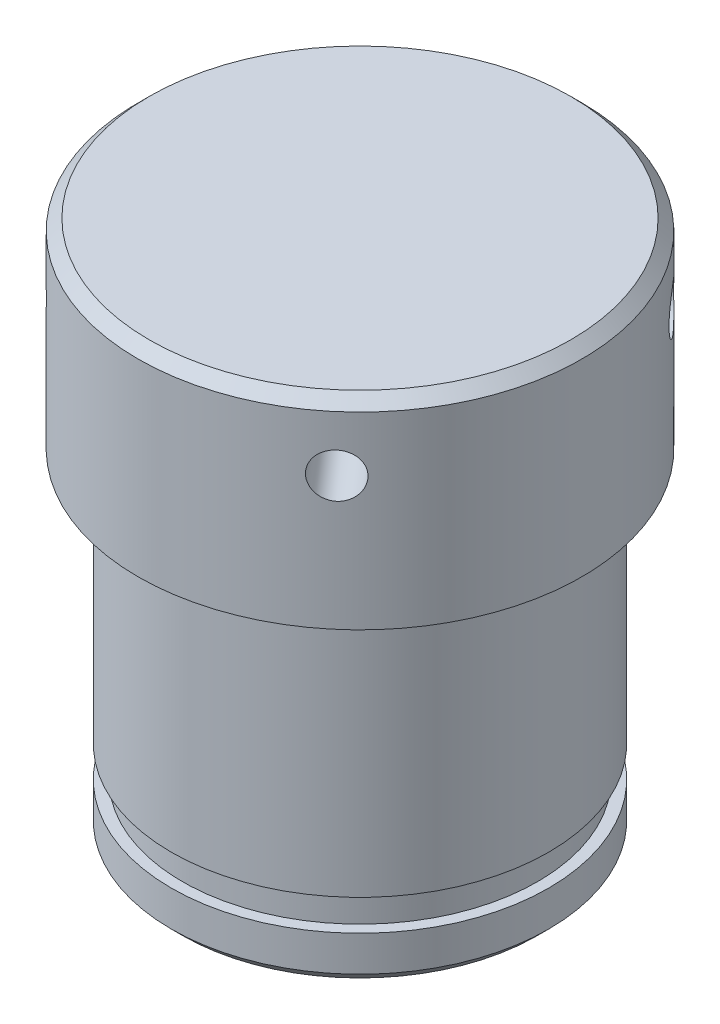
ISO-10303-21;
HEADER;
FILE_DESCRIPTION(('STEP AP214'),'2;1');
FILE_NAME('part.step','',(''),(''),'','','');
FILE_SCHEMA(('AUTOMOTIVE_DESIGN { 1 0 10303 214 1 1 1 1 }'));
ENDSEC;
DATA;
#1=APPLICATION_CONTEXT('core data for automotive mechanical design processes');
#2=APPLICATION_PROTOCOL_DEFINITION('international standard','automotive_design',2000,#1);
#3=PRODUCT_CONTEXT('',#1,'mechanical');
#4=PRODUCT('Part','Part','',(#3));
#5=PRODUCT_RELATED_PRODUCT_CATEGORY('part','',(#4));
#6=PRODUCT_DEFINITION_FORMATION('','',#4);
#7=PRODUCT_DEFINITION_CONTEXT('part definition',#1,'design');
#8=PRODUCT_DEFINITION('design','',#6,#7);
#9=PRODUCT_DEFINITION_SHAPE('','',#8);
#10=(LENGTH_UNIT() NAMED_UNIT(*) SI_UNIT(.MILLI.,.METRE.));
#11=(NAMED_UNIT(*) PLANE_ANGLE_UNIT() SI_UNIT($,.RADIAN.));
#12=(NAMED_UNIT(*) SI_UNIT($,.STERADIAN.) SOLID_ANGLE_UNIT());
#13=UNCERTAINTY_MEASURE_WITH_UNIT(LENGTH_MEASURE(1.E-05),#10,'distance_accuracy_value','');
#14=(GEOMETRIC_REPRESENTATION_CONTEXT(3) GLOBAL_UNCERTAINTY_ASSIGNED_CONTEXT((#13)) GLOBAL_UNIT_ASSIGNED_CONTEXT((#10,
#11,#12)) REPRESENTATION_CONTEXT('',''));
#15=CARTESIAN_POINT('',(0.,0.,0.));
#16=DIRECTION('',(0.,0.,1.));
#17=DIRECTION('',(1.,0.,0.));
#18=AXIS2_PLACEMENT_3D('',#15,#16,#17);
#19=CARTESIAN_POINT('',(0.,15.,0.));
#20=DIRECTION('',(0.,-1.,0.));
#21=DIRECTION('',(0.,0.,-1.));
#22=AXIS2_PLACEMENT_3D('',#19,#20,#21);
#23=CYLINDRICAL_SURFACE('',#22,8.5);
#24=CARTESIAN_POINT('',(0.,15.,0.));
#25=DIRECTION('',(0.,1.,0.));
#26=DIRECTION('',(0.,0.,1.));
#27=AXIS2_PLACEMENT_3D('',#24,#25,#26);
#28=CIRCLE('',#27,8.5);
#29=CARTESIAN_POINT('',(0.,15.,8.5));
#30=VERTEX_POINT('',#29);
#31=EDGE_CURVE('E106',#30,#30,#28,.T.);
#32=ORIENTED_EDGE('',*,*,#31,.F.);
#33=EDGE_LOOP('',(#32));
#34=FACE_BOUND('',#33,.T.);
#35=CARTESIAN_POINT('',(0.,3.5,0.));
#36=DIRECTION('',(0.,-1.,0.));
#37=DIRECTION('',(0.,0.,-1.));
#38=AXIS2_PLACEMENT_3D('',#35,#36,#37);
#39=CIRCLE('',#38,8.5);
#40=CARTESIAN_POINT('',(0.,3.5,-8.5));
#41=VERTEX_POINT('',#40);
#42=EDGE_CURVE('E117',#41,#41,#39,.T.);
#43=ORIENTED_EDGE('',*,*,#42,.F.);
#44=EDGE_LOOP('',(#43));
#45=FACE_BOUND('',#44,.T.);
#46=ADVANCED_FACE('F32',(#34,#45),#23,.T.);
#47=CARTESIAN_POINT('',(0.,24.,0.));
#48=DIRECTION('',(0.,-1.,0.));
#49=DIRECTION('',(0.,0.,-1.));
#50=AXIS2_PLACEMENT_3D('',#47,#48,#49);
#51=CYLINDRICAL_SURFACE('',#50,10.);
#52=CARTESIAN_POINT('',(-6.88779335765162,21.,7.2497105226547));
#53=CARTESIAN_POINT('',(-6.8877954387299,20.9439804358264,7.24970911231659));
#54=CARTESIAN_POINT('',(-6.89123740478512,20.8879238315882,7.24644321878474));
#55=CARTESIAN_POINT('',(-6.90488616203703,20.7773648137065,7.23343849869102));
#56=CARTESIAN_POINT('',(-6.91510040834592,20.7228641819625,7.2236925386604));
#57=CARTESIAN_POINT('',(-6.94190434988702,20.6170341807821,7.19793771359398));
#58=CARTESIAN_POINT('',(-6.95849017997176,20.5657029106086,7.1819326453697));
#59=CARTESIAN_POINT('',(-6.99742346204172,20.4676322077083,7.14400447645492));
#60=CARTESIAN_POINT('',(-7.01976976968136,20.4208918655163,7.12208255113489));
#61=CARTESIAN_POINT('',(-7.06950923647996,20.3331487363425,7.07271287099275));
#62=CARTESIAN_POINT('',(-7.09691848103652,20.2921649904962,7.04524747755616));
#63=CARTESIAN_POINT('',(-7.15578569200272,20.2172623909964,6.98544829129824));
#64=CARTESIAN_POINT('',(-7.18724384355321,20.1833438605937,6.9531142758422));
#65=CARTESIAN_POINT('',(-7.25322183931614,20.1234687429928,6.8842608674869));
#66=CARTESIAN_POINT('',(-7.28774796558653,20.0975290012063,6.84773284000553));
#67=CARTESIAN_POINT('',(-7.35867907900613,20.0544555668513,6.77145123350665));
#68=CARTESIAN_POINT('',(-7.39508402033327,20.0373216596305,6.73169773314108));
#69=CARTESIAN_POINT('',(-7.46850479739257,20.0124020906467,6.65014546957662));
#70=CARTESIAN_POINT('',(-7.50551816535506,20.0045851672501,6.60835403852411));
#71=CARTESIAN_POINT('',(-7.57916754169914,19.9984247308663,6.52375383186154));
#72=CARTESIAN_POINT('',(-7.61580355984019,20.0000809722537,6.48094508265774));
#73=CARTESIAN_POINT('',(-7.687532303811,20.0127944726502,6.39569700586083));
#74=CARTESIAN_POINT('',(-7.72263007681311,20.0238181155639,6.35325690480038));
#75=CARTESIAN_POINT('',(-7.79049827614089,20.0549011289466,6.26985082290275));
#76=CARTESIAN_POINT('',(-7.82326867222848,20.0749606167876,6.22888486122151));
#77=CARTESIAN_POINT('',(-7.885737350894,20.1235827632544,6.14960978811285));
#78=CARTESIAN_POINT('',(-7.91543013554833,20.1521602975302,6.11130547040603));
#79=CARTESIAN_POINT('',(-7.97100749523507,20.2169965233364,6.03863689179379));
#80=CARTESIAN_POINT('',(-7.99689195853994,20.2532554401452,6.00427274649065));
#81=CARTESIAN_POINT('',(-8.04441362086113,20.3326142295136,5.9404547669509));
#82=CARTESIAN_POINT('',(-8.06603173750447,20.3757433447416,5.91102307907151));
#83=CARTESIAN_POINT('',(-8.10444887807118,20.4675168652108,5.85824013763746));
#84=CARTESIAN_POINT('',(-8.1212478950042,20.5161612784521,5.83488889290282));
#85=CARTESIAN_POINT('',(-8.14971075806318,20.6176070251998,5.79506830871614));
#86=CARTESIAN_POINT('',(-8.16137352144639,20.6704092324229,5.77860042034031));
#87=CARTESIAN_POINT('',(-8.17934224106714,20.7786606046147,5.75313875351411));
#88=CARTESIAN_POINT('',(-8.18564836050389,20.8341096888874,5.74414474735949));
#89=CARTESIAN_POINT('',(-8.19277353934073,20.9458241795295,5.73397775002697));
#90=CARTESIAN_POINT('',(-8.19361620322327,21.0020850202648,5.73277111415751));
#91=CARTESIAN_POINT('',(-8.18986206067249,21.1140512658229,5.73813294708957));
#92=CARTESIAN_POINT('',(-8.18526532773736,21.1697566781404,5.74470131083379));
#93=CARTESIAN_POINT('',(-8.17073116517587,21.2789115822783,5.76535423778599));
#94=CARTESIAN_POINT('',(-8.16080498513259,21.3323655710947,5.77942296851802));
#95=CARTESIAN_POINT('',(-8.13579962486245,21.4356400517303,5.81457022577763));
#96=CARTESIAN_POINT('',(-8.12072032659835,21.4854604602872,5.83564891287487));
#97=CARTESIAN_POINT('',(-8.08562883652609,21.5802399740288,5.88417390106845));
#98=CARTESIAN_POINT('',(-8.06560001664579,21.6251819419663,5.91164164774968));
#99=CARTESIAN_POINT('',(-8.02102469018398,21.7087550532741,5.97198177036837));
#100=CARTESIAN_POINT('',(-7.99647807174199,21.7473860403401,6.00485428012536));
#101=CARTESIAN_POINT('',(-7.94327568080898,21.8173816333981,6.07505674215749));
#102=CARTESIAN_POINT('',(-7.91460542297241,21.8487195595862,6.1124023264841));
#103=CARTESIAN_POINT('',(-7.85386105238739,21.9030558685064,6.19025856523351));
#104=CARTESIAN_POINT('',(-7.82178698628645,21.9260543655071,6.2307691762792));
#105=CARTESIAN_POINT('',(-7.75506782973163,21.9630137676553,6.31361578505896));
#106=CARTESIAN_POINT('',(-7.72042744745577,21.9769907873252,6.35594838314749));
#107=CARTESIAN_POINT('',(-7.64942583799167,21.9955630695798,6.44122356943876));
#108=CARTESIAN_POINT('',(-7.61306465919627,22.000158595834,6.48416614046387));
#109=CARTESIAN_POINT('',(-7.53979502446728,21.9998337335601,6.56921822776117));
#110=CARTESIAN_POINT('',(-7.50288964734233,21.9949547631633,6.61133056061014));
#111=CARTESIAN_POINT('',(-7.42945727237713,21.975906254343,6.69374424073089));
#112=CARTESIAN_POINT('',(-7.39293027483389,21.961736708627,6.73404558658115));
#113=CARTESIAN_POINT('',(-7.32137960515219,21.9245207426071,6.81176870253131));
#114=CARTESIAN_POINT('',(-7.28635572869129,21.9014755330658,6.84919086455652));
#115=CARTESIAN_POINT('',(-7.21892087472703,21.847166831083,6.9202299896315));
#116=CARTESIAN_POINT('',(-7.18650988193634,21.8159033867289,6.95384697494492));
#117=CARTESIAN_POINT('',(-7.12523852290573,21.7458903809763,7.01661678469387));
#118=CARTESIAN_POINT('',(-7.09639361224962,21.7071099837552,7.0457503023812));
#119=CARTESIAN_POINT('',(-7.04339737586096,21.6232246484546,7.09872956839301));
#120=CARTESIAN_POINT('',(-7.01924717816664,21.5781181948309,7.12257404606894));
#121=CARTESIAN_POINT('',(-6.97645237145606,21.4827356580801,7.16449682719066));
#122=CARTESIAN_POINT('',(-6.95782192115692,21.4324467186759,7.18256031114313));
#123=CARTESIAN_POINT('',(-6.92685291444032,21.3282517087538,7.21243203779398));
#124=CARTESIAN_POINT('',(-6.91450726147476,21.2743497960743,7.22424733628755));
#125=CARTESIAN_POINT('',(-6.89964628870785,21.1834522591009,7.23843513482954));
#126=CARTESIAN_POINT('',(-6.89520906778198,21.1470377486936,7.24265896398395));
#127=CARTESIAN_POINT('',(-6.88928192331488,21.0737541769575,7.24829711630606));
#128=CARTESIAN_POINT('',(-6.88779198740146,21.0368851175374,7.24971145126754));
#129=CARTESIAN_POINT('',(-6.88779335765162,21.,7.2497105226547));
#130=B_SPLINE_CURVE_WITH_KNOTS('',3,(#52,#53,#54,#55,#56,#57,#58,#59,#60,#61,#62,#63,#64,#65,
#66,#67,#68,#69,#70,#71,#72,#73,#74,#75,#76,#77,#78,#79,#80,#81,#82,#83,#84,#85,#86,#87,#88,#89,
#90,#91,#92,#93,#94,#95,#96,#97,#98,#99,#100,#101,#102,#103,#104,#105,#106,#107,#108,#109,#110,
#111,#112,#113,#114,#115,#116,#117,#118,#119,#120,#121,#122,#123,#124,#125,#126,#127,#128,#129),
.UNSPECIFIED.,.T.,.F.,(4,2,2,2,2,2,2,2,2,2,2,2,2,2,2,2,2,2,2,2,2,2,2,2,2,2,2,2,2,2,2,2,2,2,2,2,
2,2,4),(0.,0.167923994436463,0.336033151821769,0.504040490997471,0.672014480421317,
0.840531615299253,1.00905645855253,1.17793469971292,1.34680882407795,1.5151147089845,
1.68341622998232,1.85111631818662,2.01881858480974,2.18681545466413,2.35481725218529,
2.52355425085001,2.69229149427563,2.86106429117934,3.02983194595033,3.19786996307765,
3.3659057096687,3.53358814704527,3.70127442561047,3.86953189811718,4.03779353723203,
4.20666136818119,4.37552688518005,4.54408992694362,4.7126482311315,4.88047133468483,
5.04829456996658,5.21609491995246,5.38389428810799,5.55239715037989,5.72094045034525,
5.88991241070477,6.05869314894002,6.16926027606047,6.27982693903816),.UNSPECIFIED.);
#131=CARTESIAN_POINT('',(-6.88779335765162,21.,7.2497105226547));
#132=VERTEX_POINT('',#131);
#133=EDGE_CURVE('E10',#132,#132,#130,.T.);
#134=ORIENTED_EDGE('',*,*,#133,.T.);
#135=EDGE_LOOP('',(#134));
#136=FACE_BOUND('',#135,.T.);
#137=CARTESIAN_POINT('',(-7.24971052265472,21.,-6.88779335765159));
#138=CARTESIAN_POINT('',(-7.24970911231661,20.9439804358264,-6.88779543872987));
#139=CARTESIAN_POINT('',(-7.24644321878477,20.8879238315882,-6.8912374047851));
#140=CARTESIAN_POINT('',(-7.23343849869104,20.7773648137065,-6.90488616203701));
#141=CARTESIAN_POINT('',(-7.22369253866043,20.7228641819625,-6.9151004083459));
#142=CARTESIAN_POINT('',(-7.197937713594,20.6170341807821,-6.941904349887));
#143=CARTESIAN_POINT('',(-7.18193264536973,20.5657029106086,-6.95849017997173));
#144=CARTESIAN_POINT('',(-7.14400447645494,20.4676322077083,-6.9974234620417));
#145=CARTESIAN_POINT('',(-7.12208255113491,20.4208918655163,-7.01976976968133));
#146=CARTESIAN_POINT('',(-7.07271287099278,20.3331487363425,-7.06950923647994));
#147=CARTESIAN_POINT('',(-7.04524747755618,20.2921649904962,-7.09691848103649));
#148=CARTESIAN_POINT('',(-6.98544829129826,20.2172623909964,-7.15578569200269));
#149=CARTESIAN_POINT('',(-6.95311427584222,20.1833438605937,-7.18724384355318));
#150=CARTESIAN_POINT('',(-6.88426086748693,20.1234687429928,-7.25322183931611));
#151=CARTESIAN_POINT('',(-6.84773284000556,20.0975290012063,-7.2877479655865));
#152=CARTESIAN_POINT('',(-6.77145123350668,20.0544555668513,-7.3586790790061));
#153=CARTESIAN_POINT('',(-6.73169773314111,20.0373216596305,-7.39508402033325));
#154=CARTESIAN_POINT('',(-6.65014546957664,20.0124020906467,-7.46850479739255));
#155=CARTESIAN_POINT('',(-6.60835403852413,20.0045851672501,-7.50551816535504));
#156=CARTESIAN_POINT('',(-6.52375383186157,19.9984247308663,-7.57916754169912));
#157=CARTESIAN_POINT('',(-6.48094508265777,20.0000809722537,-7.61580355984017));
#158=CARTESIAN_POINT('',(-6.39569700586086,20.0127944726502,-7.68753230381098));
#159=CARTESIAN_POINT('',(-6.35325690480041,20.0238181155639,-7.72263007681309));
#160=CARTESIAN_POINT('',(-6.26985082290278,20.0549011289466,-7.79049827614087));
#161=CARTESIAN_POINT('',(-6.22888486122154,20.0749606167876,-7.82326867222846));
#162=CARTESIAN_POINT('',(-6.14960978811287,20.1235827632544,-7.88573735089398));
#163=CARTESIAN_POINT('',(-6.11130547040606,20.1521602975302,-7.9154301355483));
#164=CARTESIAN_POINT('',(-6.03863689179381,20.2169965233364,-7.97100749523505));
#165=CARTESIAN_POINT('',(-6.00427274649068,20.2532554401452,-7.99689195853992));
#166=CARTESIAN_POINT('',(-5.94045476695092,20.3326142295136,-8.04441362086111));
#167=CARTESIAN_POINT('',(-5.91102307907154,20.3757433447416,-8.06603173750445));
#168=CARTESIAN_POINT('',(-5.85824013763749,20.4675168652108,-8.10444887807116));
#169=CARTESIAN_POINT('',(-5.83488889290285,20.5161612784521,-8.12124789500418));
#170=CARTESIAN_POINT('',(-5.79506830871617,20.6176070251998,-8.14971075806316));
#171=CARTESIAN_POINT('',(-5.77860042034034,20.6704092324229,-8.16137352144637));
#172=CARTESIAN_POINT('',(-5.75313875351414,20.7786606046147,-8.17934224106712));
#173=CARTESIAN_POINT('',(-5.74414474735951,20.8341096888874,-8.18564836050387));
#174=CARTESIAN_POINT('',(-5.73397775002699,20.9458241795295,-8.19277353934071));
#175=CARTESIAN_POINT('',(-5.73277111415754,21.0020850202648,-8.19361620322325));
#176=CARTESIAN_POINT('',(-5.7381329470896,21.1140512658229,-8.18986206067247));
#177=CARTESIAN_POINT('',(-5.74470131083382,21.1697566781404,-8.18526532773734));
#178=CARTESIAN_POINT('',(-5.76535423778602,21.2789115822783,-8.17073116517585));
#179=CARTESIAN_POINT('',(-5.77942296851805,21.3323655710947,-8.16080498513257));
#180=CARTESIAN_POINT('',(-5.81457022577766,21.4356400517303,-8.13579962486244));
#181=CARTESIAN_POINT('',(-5.8356489128749,21.4854604602872,-8.12072032659833));
#182=CARTESIAN_POINT('',(-5.88417390106848,21.5802399740288,-8.08562883652606));
#183=CARTESIAN_POINT('',(-5.91164164774971,21.6251819419663,-8.06560001664576));
#184=CARTESIAN_POINT('',(-5.97198177036839,21.7087550532741,-8.02102469018396));
#185=CARTESIAN_POINT('',(-6.00485428012538,21.7473860403401,-7.99647807174197));
#186=CARTESIAN_POINT('',(-6.07505674215752,21.8173816333981,-7.94327568080896));
#187=CARTESIAN_POINT('',(-6.11240232648413,21.8487195595862,-7.91460542297238));
#188=CARTESIAN_POINT('',(-6.19025856523353,21.9030558685064,-7.85386105238737));
#189=CARTESIAN_POINT('',(-6.23076917627922,21.9260543655071,-7.82178698628642));
#190=CARTESIAN_POINT('',(-6.31361578505898,21.9630137676553,-7.75506782973162));
#191=CARTESIAN_POINT('',(-6.35594838314752,21.9769907873252,-7.72042744745575));
#192=CARTESIAN_POINT('',(-6.44122356943878,21.9955630695798,-7.64942583799165));
#193=CARTESIAN_POINT('',(-6.48416614046389,22.000158595834,-7.61306465919625));
#194=CARTESIAN_POINT('',(-6.56921822776119,21.9998337335601,-7.53979502446725));
#195=CARTESIAN_POINT('',(-6.61133056061017,21.9949547631633,-7.50288964734231));
#196=CARTESIAN_POINT('',(-6.69374424073091,21.975906254343,-7.42945727237711));
#197=CARTESIAN_POINT('',(-6.73404558658118,21.961736708627,-7.39293027483387));
#198=CARTESIAN_POINT('',(-6.81176870253134,21.9245207426071,-7.32137960515217));
#199=CARTESIAN_POINT('',(-6.84919086455654,21.9014755330658,-7.28635572869127));
#200=CARTESIAN_POINT('',(-6.92022998963153,21.847166831083,-7.21892087472701));
#201=CARTESIAN_POINT('',(-6.95384697494494,21.8159033867289,-7.18650988193632));
#202=CARTESIAN_POINT('',(-7.01661678469389,21.7458903809763,-7.12523852290571));
#203=CARTESIAN_POINT('',(-7.04575030238122,21.7071099837552,-7.0963936122496));
#204=CARTESIAN_POINT('',(-7.09872956839304,21.6232246484546,-7.04339737586094));
#205=CARTESIAN_POINT('',(-7.12257404606896,21.5781181948309,-7.01924717816661));
#206=CARTESIAN_POINT('',(-7.16449682719069,21.4827356580801,-6.97645237145603));
#207=CARTESIAN_POINT('',(-7.18256031114315,21.4324467186759,-6.9578219211569));
#208=CARTESIAN_POINT('',(-7.21243203779401,21.3282517087538,-6.9268529144403));
#209=CARTESIAN_POINT('',(-7.22424733628757,21.2743497960743,-6.91450726147473));
#210=CARTESIAN_POINT('',(-7.23843513482957,21.1834522591009,-6.89964628870782));
#211=CARTESIAN_POINT('',(-7.24265896398397,21.1470377486936,-6.89520906778195));
#212=CARTESIAN_POINT('',(-7.24829711630609,21.0737541769575,-6.88928192331485));
#213=CARTESIAN_POINT('',(-7.24971145126757,21.0368851175374,-6.88779198740143));
#214=CARTESIAN_POINT('',(-7.24971052265472,21.,-6.88779335765159));
#215=B_SPLINE_CURVE_WITH_KNOTS('',3,(#137,#138,#139,#140,#141,#142,#143,#144,#145,#146,#147,
#148,#149,#150,#151,#152,#153,#154,#155,#156,#157,#158,#159,#160,#161,#162,#163,#164,#165,#166,
#167,#168,#169,#170,#171,#172,#173,#174,#175,#176,#177,#178,#179,#180,#181,#182,#183,#184,#185,
#186,#187,#188,#189,#190,#191,#192,#193,#194,#195,#196,#197,#198,#199,#200,#201,#202,#203,#204,
#205,#206,#207,#208,#209,#210,#211,#212,#213,#214),.UNSPECIFIED.,.T.,.F.,(4,2,2,2,2,2,2,2,2,2,2,
2,2,2,2,2,2,2,2,2,2,2,2,2,2,2,2,2,2,2,2,2,2,2,2,2,2,2,4),(0.,0.16792399443646,0.336033151821769,
0.504040490997471,0.672014480421312,0.84053161529925,1.00905645855253,1.17793469971292,
1.34680882407795,1.5151147089845,1.68341622998232,1.85111631818662,2.01881858480974,
2.18681545466413,2.35481725218529,2.52355425085001,2.69229149427563,2.86106429117934,
3.02983194595033,3.19786996307765,3.3659057096687,3.53358814704527,3.70127442561048,
3.86953189811718,4.03779353723203,4.20666136818119,4.37552688518005,4.54408992694361,
4.7126482311315,4.88047133468483,5.04829456996659,5.21609491995246,5.38389428810799,
5.55239715037988,5.72094045034525,5.88991241070477,6.05869314894001,6.16926027606047,
6.27982693903816),.UNSPECIFIED.);
#216=CARTESIAN_POINT('',(-7.24971052265472,21.,-6.88779335765159));
#217=VERTEX_POINT('',#216);
#218=EDGE_CURVE('E43',#217,#217,#215,.T.);
#219=ORIENTED_EDGE('',*,*,#218,.T.);
#220=EDGE_LOOP('',(#219));
#221=FACE_BOUND('',#220,.T.);
#222=CARTESIAN_POINT('',(6.88779335765167,21.,-7.24971052265465));
#223=CARTESIAN_POINT('',(6.88779543872995,20.9439804358264,-7.24970911231654));
#224=CARTESIAN_POINT('',(6.89123740478517,20.8879238315882,-7.2464432187847));
#225=CARTESIAN_POINT('',(6.90488616203709,20.7773648137065,-7.23343849869097));
#226=CARTESIAN_POINT('',(6.91510040834597,20.7228641819625,-7.22369253866035));
#227=CARTESIAN_POINT('',(6.94190434988707,20.6170341807821,-7.19793771359393));
#228=CARTESIAN_POINT('',(6.95849017997181,20.5657029106086,-7.18193264536966));
#229=CARTESIAN_POINT('',(6.99742346204177,20.4676322077082,-7.14400447645487));
#230=CARTESIAN_POINT('',(7.01976976968141,20.4208918655163,-7.12208255113484));
#231=CARTESIAN_POINT('',(7.06950923648001,20.3331487363425,-7.0727128709927));
#232=CARTESIAN_POINT('',(7.09691848103656,20.2921649904962,-7.0452474775561));
#233=CARTESIAN_POINT('',(7.15578569200277,20.2172623909964,-6.98544829129819));
#234=CARTESIAN_POINT('',(7.18724384355325,20.1833438605937,-6.95311427584215));
#235=CARTESIAN_POINT('',(7.25322183931619,20.1234687429928,-6.88426086748685));
#236=CARTESIAN_POINT('',(7.28774796558657,20.0975290012063,-6.84773284000548));
#237=CARTESIAN_POINT('',(7.35867907900617,20.0544555668513,-6.7714512335066));
#238=CARTESIAN_POINT('',(7.39508402033332,20.0373216596305,-6.73169773314103));
#239=CARTESIAN_POINT('',(7.46850479739262,20.0124020906467,-6.65014546957657));
#240=CARTESIAN_POINT('',(7.50551816535511,20.0045851672501,-6.60835403852405));
#241=CARTESIAN_POINT('',(7.57916754169919,19.9984247308663,-6.52375383186149));
#242=CARTESIAN_POINT('',(7.61580355984024,20.0000809722537,-6.48094508265769));
#243=CARTESIAN_POINT('',(7.68753230381105,20.0127944726502,-6.39569700586078));
#244=CARTESIAN_POINT('',(7.72263007681316,20.0238181155639,-6.35325690480033));
#245=CARTESIAN_POINT('',(7.79049827614094,20.0549011289466,-6.2698508229027));
#246=CARTESIAN_POINT('',(7.82326867222853,20.0749606167876,-6.22888486122146));
#247=CARTESIAN_POINT('',(7.88573735089405,20.1235827632544,-6.14960978811279));
#248=CARTESIAN_POINT('',(7.91543013554837,20.1521602975302,-6.11130547040598));
#249=CARTESIAN_POINT('',(7.97100749523512,20.2169965233364,-6.03863689179373));
#250=CARTESIAN_POINT('',(7.99689195853998,20.2532554401452,-6.00427274649059));
#251=CARTESIAN_POINT('',(8.04441362086117,20.3326142295136,-5.94045476695084));
#252=CARTESIAN_POINT('',(8.06603173750451,20.3757433447416,-5.91102307907145));
#253=CARTESIAN_POINT('',(8.10444887807123,20.4675168652108,-5.85824013763741));
#254=CARTESIAN_POINT('',(8.12124789500424,20.5161612784521,-5.83488889290277));
#255=CARTESIAN_POINT('',(8.14971075806322,20.6176070251998,-5.79506830871609));
#256=CARTESIAN_POINT('',(8.16137352144642,20.6704092324229,-5.77860042034025));
#257=CARTESIAN_POINT('',(8.17934224106718,20.7786606046147,-5.75313875351405));
#258=CARTESIAN_POINT('',(8.18564836050393,20.8341096888874,-5.74414474735943));
#259=CARTESIAN_POINT('',(8.19277353934077,20.9458241795295,-5.73397775002691));
#260=CARTESIAN_POINT('',(8.19361620322331,21.0020850202648,-5.73277111415745));
#261=CARTESIAN_POINT('',(8.18986206067253,21.1140512658229,-5.73813294708951));
#262=CARTESIAN_POINT('',(8.1852653277374,21.1697566781404,-5.74470131083374));
#263=CARTESIAN_POINT('',(8.17073116517591,21.2789115822783,-5.76535423778594));
#264=CARTESIAN_POINT('',(8.16080498513263,21.3323655710947,-5.77942296851796));
#265=CARTESIAN_POINT('',(8.13579962486249,21.4356400517303,-5.81457022577758));
#266=CARTESIAN_POINT('',(8.12072032659839,21.4854604602872,-5.83564891287482));
#267=CARTESIAN_POINT('',(8.08562883652612,21.5802399740288,-5.88417390106839));
#268=CARTESIAN_POINT('',(8.06560001664582,21.6251819419663,-5.91164164774963));
#269=CARTESIAN_POINT('',(8.02102469018402,21.7087550532741,-5.97198177036831));
#270=CARTESIAN_POINT('',(7.99647807174203,21.7473860403401,-6.0048542801253));
#271=CARTESIAN_POINT('',(7.94327568080902,21.8173816333981,-6.07505674215743));
#272=CARTESIAN_POINT('',(7.91460542297245,21.8487195595862,-6.11240232648404));
#273=CARTESIAN_POINT('',(7.85386105238744,21.9030558685064,-6.19025856523345));
#274=CARTESIAN_POINT('',(7.82178698628649,21.9260543655071,-6.23076917627914));
#275=CARTESIAN_POINT('',(7.75506782973168,21.9630137676553,-6.3136157850589));
#276=CARTESIAN_POINT('',(7.72042744745582,21.9769907873252,-6.35594838314744));
#277=CARTESIAN_POINT('',(7.64942583799171,21.9955630695798,-6.4412235694387));
#278=CARTESIAN_POINT('',(7.61306465919632,22.000158595834,-6.48416614046382));
#279=CARTESIAN_POINT('',(7.53979502446732,21.9998337335601,-6.56921822776112));
#280=CARTESIAN_POINT('',(7.50288964734238,21.9949547631633,-6.61133056061009));
#281=CARTESIAN_POINT('',(7.42945727237718,21.975906254343,-6.69374424073084));
#282=CARTESIAN_POINT('',(7.39293027483394,21.961736708627,-6.7340455865811));
#283=CARTESIAN_POINT('',(7.32137960515224,21.9245207426071,-6.81176870253126));
#284=CARTESIAN_POINT('',(7.28635572869133,21.9014755330658,-6.84919086455647));
#285=CARTESIAN_POINT('',(7.21892087472708,21.847166831083,-6.92022998963145));
#286=CARTESIAN_POINT('',(7.18650988193639,21.8159033867289,-6.95384697494487));
#287=CARTESIAN_POINT('',(7.12523852290578,21.7458903809763,-7.01661678469382));
#288=CARTESIAN_POINT('',(7.09639361224967,21.7071099837552,-7.04575030238115));
#289=CARTESIAN_POINT('',(7.04339737586101,21.6232246484546,-7.09872956839296));
#290=CARTESIAN_POINT('',(7.01924717816669,21.5781181948309,-7.12257404606889));
#291=CARTESIAN_POINT('',(6.97645237145611,21.4827356580801,-7.16449682719061));
#292=CARTESIAN_POINT('',(6.95782192115697,21.4324467186759,-7.18256031114308));
#293=CARTESIAN_POINT('',(6.92685291444037,21.3282517087538,-7.21243203779394));
#294=CARTESIAN_POINT('',(6.91450726147481,21.2743497960743,-7.2242473362875));
#295=CARTESIAN_POINT('',(6.8996462887079,21.1834522591009,-7.23843513482949));
#296=CARTESIAN_POINT('',(6.89520906778203,21.1470377486936,-7.2426589639839));
#297=CARTESIAN_POINT('',(6.88928192331493,21.0737541769575,-7.24829711630602));
#298=CARTESIAN_POINT('',(6.88779198740151,21.0368851175374,-7.24971145126749));
#299=CARTESIAN_POINT('',(6.88779335765167,21.,-7.24971052265465));
#300=B_SPLINE_CURVE_WITH_KNOTS('',3,(#222,#223,#224,#225,#226,#227,#228,#229,#230,#231,#232,
#233,#234,#235,#236,#237,#238,#239,#240,#241,#242,#243,#244,#245,#246,#247,#248,#249,#250,#251,
#252,#253,#254,#255,#256,#257,#258,#259,#260,#261,#262,#263,#264,#265,#266,#267,#268,#269,#270,
#271,#272,#273,#274,#275,#276,#277,#278,#279,#280,#281,#282,#283,#284,#285,#286,#287,#288,#289,
#290,#291,#292,#293,#294,#295,#296,#297,#298,#299),.UNSPECIFIED.,.T.,.F.,(4,2,2,2,2,2,2,2,2,2,2,
2,2,2,2,2,2,2,2,2,2,2,2,2,2,2,2,2,2,2,2,2,2,2,2,2,2,2,4),(0.,0.16792399443646,0.336033151821769,
0.504040490997475,0.672014480421316,0.840531615299253,1.00905645855253,1.17793469971292,
1.34680882407795,1.5151147089845,1.68341622998232,1.85111631818662,2.01881858480974,
2.18681545466414,2.35481725218529,2.52355425085001,2.69229149427563,2.86106429117934,
3.02983194595033,3.19786996307765,3.36590570966871,3.53358814704527,3.70127442561048,
3.86953189811718,4.03779353723203,4.20666136818119,4.37552688518005,4.54408992694362,
4.7126482311315,4.88047133468483,5.04829456996658,5.21609491995246,5.38389428810799,
5.55239715037989,5.72094045034525,5.88991241070477,6.05869314894001,6.16926027606047,
6.27982693903816),.UNSPECIFIED.);
#301=CARTESIAN_POINT('',(6.88779335765167,21.,-7.24971052265465));
#302=VERTEX_POINT('',#301);
#303=EDGE_CURVE('E47',#302,#302,#300,.T.);
#304=ORIENTED_EDGE('',*,*,#303,.T.);
#305=EDGE_LOOP('',(#304));
#306=FACE_BOUND('',#305,.T.);
#307=CARTESIAN_POINT('',(7.24971052265472,21.,6.88779335765159));
#308=CARTESIAN_POINT('',(7.24970911231661,20.9439804358264,6.88779543872987));
#309=CARTESIAN_POINT('',(7.24644321878477,20.8879238315882,6.8912374047851));
#310=CARTESIAN_POINT('',(7.23343849869104,20.7773648137065,6.90488616203701));
#311=CARTESIAN_POINT('',(7.22369253866043,20.7228641819625,6.9151004083459));
#312=CARTESIAN_POINT('',(7.197937713594,20.6170341807821,6.941904349887));
#313=CARTESIAN_POINT('',(7.18193264536973,20.5657029106086,6.95849017997173));
#314=CARTESIAN_POINT('',(7.14400447645494,20.4676322077083,6.9974234620417));
#315=CARTESIAN_POINT('',(7.12208255113491,20.4208918655163,7.01976976968133));
#316=CARTESIAN_POINT('',(7.07271287099278,20.3331487363425,7.06950923647994));
#317=CARTESIAN_POINT('',(7.04524747755618,20.2921649904962,7.09691848103649));
#318=CARTESIAN_POINT('',(6.98544829129826,20.2172623909964,7.15578569200269));
#319=CARTESIAN_POINT('',(6.95311427584222,20.1833438605937,7.18724384355318));
#320=CARTESIAN_POINT('',(6.88426086748693,20.1234687429928,7.25322183931611));
#321=CARTESIAN_POINT('',(6.84773284000556,20.0975290012063,7.2877479655865));
#322=CARTESIAN_POINT('',(6.77145123350668,20.0544555668513,7.3586790790061));
#323=CARTESIAN_POINT('',(6.73169773314111,20.0373216596305,7.39508402033325));
#324=CARTESIAN_POINT('',(6.65014546957664,20.0124020906467,7.46850479739255));
#325=CARTESIAN_POINT('',(6.60835403852413,20.0045851672501,7.50551816535504));
#326=CARTESIAN_POINT('',(6.52375383186157,19.9984247308663,7.57916754169912));
#327=CARTESIAN_POINT('',(6.48094508265777,20.0000809722537,7.61580355984017));
#328=CARTESIAN_POINT('',(6.39569700586086,20.0127944726502,7.68753230381098));
#329=CARTESIAN_POINT('',(6.35325690480041,20.0238181155639,7.72263007681309));
#330=CARTESIAN_POINT('',(6.26985082290278,20.0549011289466,7.79049827614087));
#331=CARTESIAN_POINT('',(6.22888486122154,20.0749606167876,7.82326867222846));
#332=CARTESIAN_POINT('',(6.14960978811287,20.1235827632544,7.88573735089398));
#333=CARTESIAN_POINT('',(6.11130547040606,20.1521602975302,7.9154301355483));
#334=CARTESIAN_POINT('',(6.03863689179381,20.2169965233364,7.97100749523505));
#335=CARTESIAN_POINT('',(6.00427274649068,20.2532554401452,7.99689195853992));
#336=CARTESIAN_POINT('',(5.94045476695092,20.3326142295136,8.04441362086111));
#337=CARTESIAN_POINT('',(5.91102307907154,20.3757433447416,8.06603173750445));
#338=CARTESIAN_POINT('',(5.85824013763749,20.4675168652108,8.10444887807116));
#339=CARTESIAN_POINT('',(5.83488889290285,20.5161612784521,8.12124789500418));
#340=CARTESIAN_POINT('',(5.79506830871617,20.6176070251998,8.14971075806316));
#341=CARTESIAN_POINT('',(5.77860042034034,20.6704092324229,8.16137352144637));
#342=CARTESIAN_POINT('',(5.75313875351414,20.7786606046147,8.17934224106712));
#343=CARTESIAN_POINT('',(5.74414474735951,20.8341096888874,8.18564836050387));
#344=CARTESIAN_POINT('',(5.73397775002699,20.9458241795295,8.19277353934071));
#345=CARTESIAN_POINT('',(5.73277111415754,21.0020850202648,8.19361620322325));
#346=CARTESIAN_POINT('',(5.7381329470896,21.1140512658229,8.18986206067247));
#347=CARTESIAN_POINT('',(5.74470131083382,21.1697566781404,8.18526532773734));
#348=CARTESIAN_POINT('',(5.76535423778602,21.2789115822783,8.17073116517585));
#349=CARTESIAN_POINT('',(5.77942296851805,21.3323655710947,8.16080498513257));
#350=CARTESIAN_POINT('',(5.81457022577766,21.4356400517303,8.13579962486244));
#351=CARTESIAN_POINT('',(5.8356489128749,21.4854604602872,8.12072032659833));
#352=CARTESIAN_POINT('',(5.88417390106848,21.5802399740288,8.08562883652606));
#353=CARTESIAN_POINT('',(5.91164164774971,21.6251819419663,8.06560001664576));
#354=CARTESIAN_POINT('',(5.97198177036839,21.7087550532741,8.02102469018396));
#355=CARTESIAN_POINT('',(6.00485428012538,21.7473860403401,7.99647807174197));
#356=CARTESIAN_POINT('',(6.07505674215752,21.8173816333981,7.94327568080896));
#357=CARTESIAN_POINT('',(6.11240232648413,21.8487195595862,7.91460542297238));
#358=CARTESIAN_POINT('',(6.19025856523353,21.9030558685064,7.85386105238737));
#359=CARTESIAN_POINT('',(6.23076917627922,21.9260543655071,7.82178698628642));
#360=CARTESIAN_POINT('',(6.31361578505898,21.9630137676553,7.75506782973162));
#361=CARTESIAN_POINT('',(6.35594838314752,21.9769907873252,7.72042744745575));
#362=CARTESIAN_POINT('',(6.44122356943878,21.9955630695798,7.64942583799165));
#363=CARTESIAN_POINT('',(6.48416614046389,22.000158595834,7.61306465919625));
#364=CARTESIAN_POINT('',(6.56921822776119,21.9998337335601,7.53979502446725));
#365=CARTESIAN_POINT('',(6.61133056061017,21.9949547631633,7.50288964734231));
#366=CARTESIAN_POINT('',(6.69374424073091,21.975906254343,7.42945727237711));
#367=CARTESIAN_POINT('',(6.73404558658118,21.961736708627,7.39293027483387));
#368=CARTESIAN_POINT('',(6.81176870253134,21.9245207426071,7.32137960515217));
#369=CARTESIAN_POINT('',(6.84919086455654,21.9014755330658,7.28635572869127));
#370=CARTESIAN_POINT('',(6.92022998963153,21.847166831083,7.21892087472701));
#371=CARTESIAN_POINT('',(6.95384697494494,21.8159033867289,7.18650988193632));
#372=CARTESIAN_POINT('',(7.01661678469389,21.7458903809763,7.12523852290571));
#373=CARTESIAN_POINT('',(7.04575030238122,21.7071099837552,7.0963936122496));
#374=CARTESIAN_POINT('',(7.09872956839304,21.6232246484546,7.04339737586094));
#375=CARTESIAN_POINT('',(7.12257404606896,21.5781181948309,7.01924717816661));
#376=CARTESIAN_POINT('',(7.16449682719069,21.4827356580801,6.97645237145603));
#377=CARTESIAN_POINT('',(7.18256031114315,21.4324467186759,6.9578219211569));
#378=CARTESIAN_POINT('',(7.21243203779401,21.3282517087538,6.9268529144403));
#379=CARTESIAN_POINT('',(7.22424733628757,21.2743497960743,6.91450726147473));
#380=CARTESIAN_POINT('',(7.23843513482957,21.1834522591009,6.89964628870782));
#381=CARTESIAN_POINT('',(7.24265896398397,21.1470377486936,6.89520906778195));
#382=CARTESIAN_POINT('',(7.24829711630609,21.0737541769575,6.88928192331485));
#383=CARTESIAN_POINT('',(7.24971145126757,21.0368851175374,6.88779198740143));
#384=CARTESIAN_POINT('',(7.24971052265472,21.,6.88779335765159));
#385=B_SPLINE_CURVE_WITH_KNOTS('',3,(#307,#308,#309,#310,#311,#312,#313,#314,#315,#316,#317,
#318,#319,#320,#321,#322,#323,#324,#325,#326,#327,#328,#329,#330,#331,#332,#333,#334,#335,#336,
#337,#338,#339,#340,#341,#342,#343,#344,#345,#346,#347,#348,#349,#350,#351,#352,#353,#354,#355,
#356,#357,#358,#359,#360,#361,#362,#363,#364,#365,#366,#367,#368,#369,#370,#371,#372,#373,#374,
#375,#376,#377,#378,#379,#380,#381,#382,#383,#384),.UNSPECIFIED.,.T.,.F.,(4,2,2,2,2,2,2,2,2,2,2,
2,2,2,2,2,2,2,2,2,2,2,2,2,2,2,2,2,2,2,2,2,2,2,2,2,2,2,4),(0.,0.16792399443646,0.336033151821769,
0.504040490997471,0.672014480421312,0.84053161529925,1.00905645855253,1.17793469971292,
1.34680882407795,1.5151147089845,1.68341622998232,1.85111631818662,2.01881858480974,
2.18681545466413,2.35481725218529,2.52355425085001,2.69229149427563,2.86106429117934,
3.02983194595033,3.19786996307765,3.3659057096687,3.53358814704527,3.70127442561048,
3.86953189811718,4.03779353723203,4.20666136818119,4.37552688518005,4.54408992694361,
4.7126482311315,4.88047133468483,5.04829456996659,5.21609491995246,5.38389428810799,
5.55239715037988,5.72094045034525,5.88991241070477,6.05869314894001,6.16926027606047,
6.27982693903816),.UNSPECIFIED.);
#386=CARTESIAN_POINT('',(7.24971052265472,21.,6.88779335765159));
#387=VERTEX_POINT('',#386);
#388=EDGE_CURVE('E51',#387,#387,#385,.T.);
#389=ORIENTED_EDGE('',*,*,#388,.T.);
#390=EDGE_LOOP('',(#389));
#391=FACE_BOUND('',#390,.T.);
#392=CARTESIAN_POINT('',(0.,23.5,0.));
#393=DIRECTION('',(0.,1.,0.));
#394=DIRECTION('',(0.,0.,1.));
#395=AXIS2_PLACEMENT_3D('',#392,#393,#394);
#396=CIRCLE('',#395,10.);
#397=CARTESIAN_POINT('',(0.,23.5,10.));
#398=VERTEX_POINT('',#397);
#399=EDGE_CURVE('E100',#398,#398,#396,.F.);
#400=ORIENTED_EDGE('',*,*,#399,.T.);
#401=EDGE_LOOP('',(#400));
#402=FACE_BOUND('',#401,.T.);
#403=CARTESIAN_POINT('',(0.,15.,0.));
#404=DIRECTION('',(0.,1.,0.));
#405=DIRECTION('',(0.,0.,1.));
#406=AXIS2_PLACEMENT_3D('',#403,#404,#405);
#407=CIRCLE('',#406,10.);
#408=CARTESIAN_POINT('',(0.,15.,10.));
#409=VERTEX_POINT('',#408);
#410=EDGE_CURVE('E109',#409,#409,#407,.T.);
#411=ORIENTED_EDGE('',*,*,#410,.T.);
#412=EDGE_LOOP('',(#411));
#413=FACE_BOUND('',#412,.T.);
#414=ADVANCED_FACE('F60',(#136,#221,#306,#391,#402,#413),#51,.T.);
#415=CARTESIAN_POINT('',(0.,24.,0.));
#416=DIRECTION('',(0.,1.,0.));
#417=DIRECTION('',(0.,0.,1.));
#418=AXIS2_PLACEMENT_3D('',#415,#416,#417);
#419=PLANE('',#418);
#420=CARTESIAN_POINT('',(0.,24.,0.));
#421=DIRECTION('',(0.,1.,0.));
#422=DIRECTION('',(0.,0.,1.));
#423=AXIS2_PLACEMENT_3D('',#420,#421,#422);
#424=CIRCLE('',#423,9.5);
#425=CARTESIAN_POINT('',(0.,24.,9.5));
#426=VERTEX_POINT('',#425);
#427=EDGE_CURVE('E103',#426,#426,#424,.T.);
#428=ORIENTED_EDGE('',*,*,#427,.T.);
#429=EDGE_LOOP('',(#428));
#430=FACE_BOUND('',#429,.T.);
#431=ADVANCED_FACE('F180',(#430),#419,.T.);
#432=CARTESIAN_POINT('',(0.,15.,0.));
#433=DIRECTION('',(0.,1.,0.));
#434=DIRECTION('',(0.,0.,1.));
#435=AXIS2_PLACEMENT_3D('',#432,#433,#434);
#436=PLANE('',#435);
#437=ORIENTED_EDGE('',*,*,#31,.T.);
#438=EDGE_LOOP('',(#437));
#439=FACE_BOUND('',#438,.T.);
#440=ORIENTED_EDGE('',*,*,#410,.F.);
#441=EDGE_LOOP('',(#440));
#442=FACE_BOUND('',#441,.T.);
#443=ADVANCED_FACE('F209',(#439,#442),#436,.F.);
#444=CARTESIAN_POINT('',(0.,3.5,0.));
#445=DIRECTION('',(0.,-1.,0.));
#446=DIRECTION('',(0.,0.,-1.));
#447=AXIS2_PLACEMENT_3D('',#444,#445,#446);
#448=PLANE('',#447);
#449=CARTESIAN_POINT('',(0.,3.5,0.));
#450=DIRECTION('',(0.,-1.,0.));
#451=DIRECTION('',(0.,0.,-1.));
#452=AXIS2_PLACEMENT_3D('',#449,#450,#451);
#453=CIRCLE('',#452,8.);
#454=CARTESIAN_POINT('',(0.,3.5,-8.));
#455=VERTEX_POINT('',#454);
#456=EDGE_CURVE('E140',#455,#455,#453,.T.);
#457=ORIENTED_EDGE('',*,*,#456,.F.);
#458=EDGE_LOOP('',(#457));
#459=FACE_BOUND('',#458,.T.);
#460=ORIENTED_EDGE('',*,*,#42,.T.);
#461=EDGE_LOOP('',(#460));
#462=FACE_BOUND('',#461,.T.);
#463=ADVANCED_FACE('F200',(#459,#462),#448,.T.);
#464=CARTESIAN_POINT('',(0.,2.1,0.));
#465=DIRECTION('',(0.,-1.,0.));
#466=DIRECTION('',(0.,0.,-1.));
#467=AXIS2_PLACEMENT_3D('',#464,#465,#466);
#468=PLANE('',#467);
#469=CARTESIAN_POINT('',(0.,2.1,0.));
#470=DIRECTION('',(0.,-1.,0.));
#471=DIRECTION('',(0.,0.,-1.));
#472=AXIS2_PLACEMENT_3D('',#469,#470,#471);
#473=CIRCLE('',#472,8.);
#474=CARTESIAN_POINT('',(0.,2.1,-8.));
#475=VERTEX_POINT('',#474);
#476=EDGE_CURVE('E143',#475,#475,#473,.T.);
#477=ORIENTED_EDGE('',*,*,#476,.T.);
#478=EDGE_LOOP('',(#477));
#479=FACE_BOUND('',#478,.T.);
#480=CARTESIAN_POINT('',(0.,2.1,0.));
#481=DIRECTION('',(0.,-1.,0.));
#482=DIRECTION('',(0.,0.,-1.));
#483=AXIS2_PLACEMENT_3D('',#480,#481,#482);
#484=CIRCLE('',#483,8.5);
#485=CARTESIAN_POINT('',(0.,2.1,-8.5));
#486=VERTEX_POINT('',#485);
#487=EDGE_CURVE('E137',#486,#486,#484,.T.);
#488=ORIENTED_EDGE('',*,*,#487,.F.);
#489=EDGE_LOOP('',(#488));
#490=FACE_BOUND('',#489,.T.);
#491=ADVANCED_FACE('F198',(#479,#490),#468,.F.);
#492=CARTESIAN_POINT('',(0.,3.5,0.));
#493=DIRECTION('',(0.,-1.,0.));
#494=DIRECTION('',(0.,0.,-1.));
#495=AXIS2_PLACEMENT_3D('',#492,#493,#494);
#496=CYLINDRICAL_SURFACE('',#495,8.);
#497=ORIENTED_EDGE('',*,*,#456,.T.);
#498=EDGE_LOOP('',(#497));
#499=FACE_BOUND('',#498,.T.);
#500=ORIENTED_EDGE('',*,*,#476,.F.);
#501=EDGE_LOOP('',(#500));
#502=FACE_BOUND('',#501,.T.);
#503=ADVANCED_FACE('F88',(#499,#502),#496,.T.);
#504=CARTESIAN_POINT('',(-5.99999999999983,10.,-1.70530256582424E-13));
#505=DIRECTION('',(0.,-1.,0.));
#506=DIRECTION('',(0.,0.,-1.));
#507=AXIS2_PLACEMENT_3D('',#504,#505,#506);
#508=PLANE('',#507);
#509=CARTESIAN_POINT('',(-5.99999999999983,10.,-1.70530256582424E-13));
#510=DIRECTION('',(0.,-1.,0.));
#511=DIRECTION('',(0.,0.,-1.));
#512=AXIS2_PLACEMENT_3D('',#509,#510,#511);
#513=CIRCLE('',#512,1.00000000000027);
#514=CARTESIAN_POINT('',(-5.99999999999983,10.,-1.00000000000044));
#515=VERTEX_POINT('',#514);
#516=EDGE_CURVE('E116',#515,#515,#513,.T.);
#517=ORIENTED_EDGE('',*,*,#516,.T.);
#518=EDGE_LOOP('',(#517));
#519=FACE_BOUND('',#518,.T.);
#520=ADVANCED_FACE('F207',(#519),#508,.T.);
#521=CARTESIAN_POINT('',(3.39590937005871E-13,10.,-6.));
#522=DIRECTION('',(0.,-1.,0.));
#523=DIRECTION('',(0.,0.,-1.));
#524=AXIS2_PLACEMENT_3D('',#521,#522,#523);
#525=PLANE('',#524);
#526=CARTESIAN_POINT('',(3.39590937005871E-13,10.,-6.));
#527=DIRECTION('',(0.,-1.,0.));
#528=DIRECTION('',(0.,0.,-1.));
#529=AXIS2_PLACEMENT_3D('',#526,#527,#528);
#530=CIRCLE('',#529,1.00000000000036);
#531=CARTESIAN_POINT('',(3.39590937005871E-13,10.,-7.00000000000037));
#532=VERTEX_POINT('',#531);
#533=EDGE_CURVE('E123',#532,#532,#530,.T.);
#534=ORIENTED_EDGE('',*,*,#533,.T.);
#535=EDGE_LOOP('',(#534));
#536=FACE_BOUND('',#535,.T.);
#537=ADVANCED_FACE('F224',(#536),#525,.T.);
#538=CARTESIAN_POINT('',(6.00000000000017,10.,1.69795468502936E-13));
#539=DIRECTION('',(0.,-1.,0.));
#540=DIRECTION('',(0.,0.,-1.));
#541=AXIS2_PLACEMENT_3D('',#538,#539,#540);
#542=PLANE('',#541);
#543=CARTESIAN_POINT('',(6.00000000000017,10.,1.69795468502936E-13));
#544=DIRECTION('',(0.,-1.,0.));
#545=DIRECTION('',(0.,0.,-1.));
#546=AXIS2_PLACEMENT_3D('',#543,#544,#545);
#547=CIRCLE('',#546,1.00000000000013);
#548=CARTESIAN_POINT('',(6.00000000000017,10.,-0.999999999999963));
#549=VERTEX_POINT('',#548);
#550=EDGE_CURVE('E129',#549,#549,#547,.T.);
#551=ORIENTED_EDGE('',*,*,#550,.T.);
#552=EDGE_LOOP('',(#551));
#553=FACE_BOUND('',#552,.T.);
#554=ADVANCED_FACE('F216',(#553),#542,.T.);
#555=CARTESIAN_POINT('',(0.,10.,6.));
#556=DIRECTION('',(0.,-1.,0.));
#557=DIRECTION('',(0.,0.,-1.));
#558=AXIS2_PLACEMENT_3D('',#555,#556,#557);
#559=PLANE('',#558);
#560=CARTESIAN_POINT('',(0.,10.,6.));
#561=DIRECTION('',(0.,-1.,0.));
#562=DIRECTION('',(0.,0.,-1.));
#563=AXIS2_PLACEMENT_3D('',#560,#561,#562);
#564=CIRCLE('',#563,1.);
#565=CARTESIAN_POINT('',(0.,10.,5.));
#566=VERTEX_POINT('',#565);
#567=EDGE_CURVE('E112',#566,#566,#564,.T.);
#568=ORIENTED_EDGE('',*,*,#567,.T.);
#569=EDGE_LOOP('',(#568));
#570=FACE_BOUND('',#569,.T.);
#571=ADVANCED_FACE('F212',(#570),#559,.T.);
#572=CARTESIAN_POINT('',(-5.99999999999983,10.,-1.70530256582424E-13));
#573=DIRECTION('',(0.,-1.,0.));
#574=DIRECTION('',(0.,0.,-1.));
#575=AXIS2_PLACEMENT_3D('',#572,#573,#574);
#576=CYLINDRICAL_SURFACE('',#575,1.00000000000027);
#577=ORIENTED_EDGE('',*,*,#516,.F.);
#578=EDGE_LOOP('',(#577));
#579=FACE_BOUND('',#578,.T.);
#580=CARTESIAN_POINT('',(-5.99999999999983,0.,-1.70530256582424E-13));
#581=DIRECTION('',(0.,-1.,0.));
#582=DIRECTION('',(0.,0.,-1.));
#583=AXIS2_PLACEMENT_3D('',#580,#581,#582);
#584=CIRCLE('',#583,1.00000000000027);
#585=CARTESIAN_POINT('',(-5.99999999999983,0.,-1.00000000000044));
#586=VERTEX_POINT('',#585);
#587=EDGE_CURVE('E113',#586,#586,#584,.T.);
#588=ORIENTED_EDGE('',*,*,#587,.T.);
#589=EDGE_LOOP('',(#588));
#590=FACE_BOUND('',#589,.T.);
#591=ADVANCED_FACE('F215',(#579,#590),#576,.F.);
#592=CARTESIAN_POINT('',(3.39590937005871E-13,10.,-6.));
#593=DIRECTION('',(0.,-1.,0.));
#594=DIRECTION('',(0.,0.,-1.));
#595=AXIS2_PLACEMENT_3D('',#592,#593,#594);
#596=CYLINDRICAL_SURFACE('',#595,1.00000000000036);
#597=ORIENTED_EDGE('',*,*,#533,.F.);
#598=EDGE_LOOP('',(#597));
#599=FACE_BOUND('',#598,.T.);
#600=CARTESIAN_POINT('',(3.39590937005871E-13,0.,-6.));
#601=DIRECTION('',(0.,-1.,0.));
#602=DIRECTION('',(0.,0.,-1.));
#603=AXIS2_PLACEMENT_3D('',#600,#601,#602);
#604=CIRCLE('',#603,1.00000000000036);
#605=CARTESIAN_POINT('',(3.39590937005871E-13,0.,-7.00000000000037));
#606=VERTEX_POINT('',#605);
#607=EDGE_CURVE('E120',#606,#606,#604,.T.);
#608=ORIENTED_EDGE('',*,*,#607,.T.);
#609=EDGE_LOOP('',(#608));
#610=FACE_BOUND('',#609,.T.);
#611=ADVANCED_FACE('F228',(#599,#610),#596,.F.);
#612=CARTESIAN_POINT('',(6.00000000000017,10.,1.69795468502936E-13));
#613=DIRECTION('',(0.,-1.,0.));
#614=DIRECTION('',(0.,0.,-1.));
#615=AXIS2_PLACEMENT_3D('',#612,#613,#614);
#616=CYLINDRICAL_SURFACE('',#615,1.00000000000013);
#617=ORIENTED_EDGE('',*,*,#550,.F.);
#618=EDGE_LOOP('',(#617));
#619=FACE_BOUND('',#618,.T.);
#620=CARTESIAN_POINT('',(6.00000000000017,0.,1.69795468502936E-13));
#621=DIRECTION('',(0.,-1.,0.));
#622=DIRECTION('',(0.,0.,-1.));
#623=AXIS2_PLACEMENT_3D('',#620,#621,#622);
#624=CIRCLE('',#623,1.00000000000013);
#625=CARTESIAN_POINT('',(6.00000000000017,0.,-0.999999999999963));
#626=VERTEX_POINT('',#625);
#627=EDGE_CURVE('E126',#626,#626,#624,.T.);
#628=ORIENTED_EDGE('',*,*,#627,.T.);
#629=EDGE_LOOP('',(#628));
#630=FACE_BOUND('',#629,.T.);
#631=ADVANCED_FACE('F220',(#619,#630),#616,.F.);
#632=CARTESIAN_POINT('',(0.,10.,6.));
#633=DIRECTION('',(0.,-1.,0.));
#634=DIRECTION('',(0.,0.,-1.));
#635=AXIS2_PLACEMENT_3D('',#632,#633,#634);
#636=CYLINDRICAL_SURFACE('',#635,1.);
#637=ORIENTED_EDGE('',*,*,#567,.F.);
#638=EDGE_LOOP('',(#637));
#639=FACE_BOUND('',#638,.T.);
#640=CARTESIAN_POINT('',(0.,0.,6.));
#641=DIRECTION('',(0.,-1.,0.));
#642=DIRECTION('',(0.,0.,-1.));
#643=AXIS2_PLACEMENT_3D('',#640,#641,#642);
#644=CIRCLE('',#643,1.);
#645=CARTESIAN_POINT('',(0.,0.,5.));
#646=VERTEX_POINT('',#645);
#647=EDGE_CURVE('E132',#646,#646,#644,.T.);
#648=ORIENTED_EDGE('',*,*,#647,.T.);
#649=EDGE_LOOP('',(#648));
#650=FACE_BOUND('',#649,.T.);
#651=ADVANCED_FACE('F192',(#639,#650),#636,.F.);
#652=CARTESIAN_POINT('',(0.,0.,0.));
#653=DIRECTION('',(0.,1.,0.));
#654=DIRECTION('',(0.,0.,1.));
#655=AXIS2_PLACEMENT_3D('',#652,#653,#654);
#656=PLANE('',#655);
#657=CARTESIAN_POINT('',(0.,0.,0.));
#658=DIRECTION('',(0.,1.,0.));
#659=DIRECTION('',(0.,0.,1.));
#660=AXIS2_PLACEMENT_3D('',#657,#658,#659);
#661=CIRCLE('',#660,7.99999999999999);
#662=CARTESIAN_POINT('',(0.,0.,7.99999999999999));
#663=VERTEX_POINT('',#662);
#664=EDGE_CURVE('E94',#663,#663,#661,.F.);
#665=ORIENTED_EDGE('',*,*,#664,.T.);
#666=EDGE_LOOP('',(#665));
#667=FACE_BOUND('',#666,.T.);
#668=ORIENTED_EDGE('',*,*,#647,.F.);
#669=EDGE_LOOP('',(#668));
#670=FACE_BOUND('',#669,.T.);
#671=ORIENTED_EDGE('',*,*,#627,.F.);
#672=EDGE_LOOP('',(#671));
#673=FACE_BOUND('',#672,.T.);
#674=ORIENTED_EDGE('',*,*,#607,.F.);
#675=EDGE_LOOP('',(#674));
#676=FACE_BOUND('',#675,.T.);
#677=ORIENTED_EDGE('',*,*,#587,.F.);
#678=EDGE_LOOP('',(#677));
#679=FACE_BOUND('',#678,.T.);
#680=ADVANCED_FACE('F185',(#667,#670,#673,#676,#679),#656,.F.);
#681=CARTESIAN_POINT('',(0.,0.500000000000009,0.));
#682=DIRECTION('',(0.,1.,0.));
#683=DIRECTION('',(0.,0.,1.));
#684=AXIS2_PLACEMENT_3D('',#681,#682,#683);
#685=CIRCLE('',#684,8.5);
#686=CARTESIAN_POINT('',(0.,0.500000000000009,8.5));
#687=VERTEX_POINT('',#686);
#688=EDGE_CURVE('E97',#687,#687,#685,.T.);
#689=ORIENTED_EDGE('',*,*,#688,.T.);
#690=EDGE_LOOP('',(#689));
#691=FACE_BOUND('',#690,.T.);
#692=ORIENTED_EDGE('',*,*,#487,.T.);
#693=EDGE_LOOP('',(#692));
#694=FACE_BOUND('',#693,.T.);
#695=ADVANCED_FACE('F176',(#691,#694),#23,.T.);
#696=CARTESIAN_POINT('',(0.,24.,0.));
#697=DIRECTION('',(0.,-1.,0.));
#698=DIRECTION('',(0.,0.,-1.));
#699=AXIS2_PLACEMENT_3D('',#696,#697,#698);
#700=CONICAL_SURFACE('',#699,9.5,0.78539816339744);
#701=ORIENTED_EDGE('',*,*,#399,.F.);
#702=EDGE_LOOP('',(#701));
#703=FACE_BOUND('',#702,.T.);
#704=ORIENTED_EDGE('',*,*,#427,.F.);
#705=EDGE_LOOP('',(#704));
#706=FACE_BOUND('',#705,.T.);
#707=ADVANCED_FACE('F184',(#703,#706),#700,.T.);
#708=CARTESIAN_POINT('',(0.,0.500000000000009,0.));
#709=DIRECTION('',(0.,1.,0.));
#710=DIRECTION('',(0.,0.,1.));
#711=AXIS2_PLACEMENT_3D('',#708,#709,#710);
#712=CONICAL_SURFACE('',#711,8.5,0.785398163397447);
#713=ORIENTED_EDGE('',*,*,#664,.F.);
#714=EDGE_LOOP('',(#713));
#715=FACE_BOUND('',#714,.T.);
#716=ORIENTED_EDGE('',*,*,#688,.F.);
#717=EDGE_LOOP('',(#716));
#718=FACE_BOUND('',#717,.T.);
#719=ADVANCED_FACE('F34',(#715,#718),#712,.T.);
#720=CARTESIAN_POINT('',(1.30491831138719,21.,1.51564778250305));
#721=DIRECTION('',(0.652459155693596,0.,0.757823891251523));
#722=DIRECTION('',(0.757823891251523,0.,-0.652459155693596));
#723=AXIS2_PLACEMENT_3D('',#720,#721,#722);
#724=CYLINDRICAL_SURFACE('',#723,1.);
#725=CARTESIAN_POINT('',(1.30491831138719,21.,1.51564778250305));
#726=DIRECTION('',(0.652459155693596,0.,0.757823891251523));
#727=DIRECTION('',(0.757823891251523,0.,-0.652459155693596));
#728=AXIS2_PLACEMENT_3D('',#725,#726,#727);
#729=CIRCLE('',#728,1.);
#730=CARTESIAN_POINT('',(2.06274220263872,21.,0.863188626809452));
#731=VERTEX_POINT('',#730);
#732=EDGE_CURVE('E146',#731,#731,#729,.T.);
#733=ORIENTED_EDGE('',*,*,#732,.F.);
#734=EDGE_LOOP('',(#733));
#735=FACE_BOUND('',#734,.T.);
#736=ORIENTED_EDGE('',*,*,#388,.F.);
#737=EDGE_LOOP('',(#736));
#738=FACE_BOUND('',#737,.T.);
#739=ADVANCED_FACE('F82',(#735,#738),#724,.F.);
#740=CARTESIAN_POINT('',(1.30491831138719,21.,1.51564778250305));
#741=DIRECTION('',(0.652459155693596,0.,0.757823891251523));
#742=DIRECTION('',(0.757823891251523,0.,-0.652459155693596));
#743=AXIS2_PLACEMENT_3D('',#740,#741,#742);
#744=PLANE('',#743);
#745=ORIENTED_EDGE('',*,*,#732,.T.);
#746=EDGE_LOOP('',(#745));
#747=FACE_BOUND('',#746,.T.);
#748=ADVANCED_FACE('F78',(#747),#744,.T.);
#749=CARTESIAN_POINT('',(1.51564778250306,21.,-1.30491831138718));
#750=DIRECTION('',(0.75782389125153,0.,-0.652459155693588));
#751=DIRECTION('',(-0.652459155693588,0.,-0.75782389125153));
#752=AXIS2_PLACEMENT_3D('',#749,#750,#751);
#753=CYLINDRICAL_SURFACE('',#752,1.);
#754=CARTESIAN_POINT('',(1.51564778250306,21.,-1.30491831138718));
#755=DIRECTION('',(0.75782389125153,0.,-0.652459155693588));
#756=DIRECTION('',(-0.652459155693588,0.,-0.75782389125153));
#757=AXIS2_PLACEMENT_3D('',#754,#755,#756);
#758=CIRCLE('',#757,1.);
#759=CARTESIAN_POINT('',(0.863188626809473,21.,-2.06274220263871));
#760=VERTEX_POINT('',#759);
#761=EDGE_CURVE('E152',#760,#760,#758,.T.);
#762=ORIENTED_EDGE('',*,*,#761,.F.);
#763=EDGE_LOOP('',(#762));
#764=FACE_BOUND('',#763,.T.);
#765=ORIENTED_EDGE('',*,*,#303,.F.);
#766=EDGE_LOOP('',(#765));
#767=FACE_BOUND('',#766,.T.);
#768=ADVANCED_FACE('F73',(#764,#767),#753,.F.);
#769=CARTESIAN_POINT('',(1.51564778250306,21.,-1.30491831138718));
#770=DIRECTION('',(0.75782389125153,0.,-0.652459155693588));
#771=DIRECTION('',(-0.652459155693588,0.,-0.75782389125153));
#772=AXIS2_PLACEMENT_3D('',#769,#770,#771);
#773=PLANE('',#772);
#774=ORIENTED_EDGE('',*,*,#761,.T.);
#775=EDGE_LOOP('',(#774));
#776=FACE_BOUND('',#775,.T.);
#777=ADVANCED_FACE('F70',(#776),#773,.T.);
#778=CARTESIAN_POINT('',(-1.30491831138719,21.,-1.51564778250305));
#779=DIRECTION('',(-0.652459155693596,0.,-0.757823891251523));
#780=DIRECTION('',(-0.757823891251523,0.,0.652459155693596));
#781=AXIS2_PLACEMENT_3D('',#778,#779,#780);
#782=CYLINDRICAL_SURFACE('',#781,1.);
#783=CARTESIAN_POINT('',(-1.30491831138719,21.,-1.51564778250305));
#784=DIRECTION('',(-0.652459155693596,0.,-0.757823891251523));
#785=DIRECTION('',(-0.757823891251523,0.,0.652459155693596));
#786=AXIS2_PLACEMENT_3D('',#783,#784,#785);
#787=CIRCLE('',#786,1.);
#788=CARTESIAN_POINT('',(-2.06274220263872,21.,-0.863188626809452));
#789=VERTEX_POINT('',#788);
#790=EDGE_CURVE('E155',#789,#789,#787,.T.);
#791=ORIENTED_EDGE('',*,*,#790,.F.);
#792=EDGE_LOOP('',(#791));
#793=FACE_BOUND('',#792,.T.);
#794=ORIENTED_EDGE('',*,*,#218,.F.);
#795=EDGE_LOOP('',(#794));
#796=FACE_BOUND('',#795,.T.);
#797=ADVANCED_FACE('F64',(#793,#796),#782,.F.);
#798=CARTESIAN_POINT('',(-1.30491831138719,21.,-1.51564778250305));
#799=DIRECTION('',(-0.652459155693596,0.,-0.757823891251523));
#800=DIRECTION('',(-0.757823891251523,0.,0.652459155693596));
#801=AXIS2_PLACEMENT_3D('',#798,#799,#800);
#802=PLANE('',#801);
#803=ORIENTED_EDGE('',*,*,#790,.T.);
#804=EDGE_LOOP('',(#803));
#805=FACE_BOUND('',#804,.T.);
#806=ADVANCED_FACE('F69',(#805),#802,.T.);
#807=CARTESIAN_POINT('',(-1.51564778250305,21.,1.30491831138719));
#808=DIRECTION('',(-0.757823891251525,0.,0.652459155693593));
#809=DIRECTION('',(0.652459155693593,0.,0.757823891251525));
#810=AXIS2_PLACEMENT_3D('',#807,#808,#809);
#811=CYLINDRICAL_SURFACE('',#810,1.);
#812=CARTESIAN_POINT('',(-1.51564778250305,21.,1.30491831138719));
#813=DIRECTION('',(-0.757823891251525,0.,0.652459155693593));
#814=DIRECTION('',(0.652459155693593,0.,0.757823891251525));
#815=AXIS2_PLACEMENT_3D('',#812,#813,#814);
#816=CIRCLE('',#815,1.);
#817=CARTESIAN_POINT('',(-0.863188626809458,21.,2.06274220263871));
#818=VERTEX_POINT('',#817);
#819=EDGE_CURVE('E151',#818,#818,#816,.T.);
#820=ORIENTED_EDGE('',*,*,#819,.F.);
#821=EDGE_LOOP('',(#820));
#822=FACE_BOUND('',#821,.T.);
#823=ORIENTED_EDGE('',*,*,#133,.F.);
#824=EDGE_LOOP('',(#823));
#825=FACE_BOUND('',#824,.T.);
#826=ADVANCED_FACE('F163',(#822,#825),#811,.F.);
#827=CARTESIAN_POINT('',(-1.51564778250305,21.,1.30491831138719));
#828=DIRECTION('',(-0.757823891251525,0.,0.652459155693593));
#829=DIRECTION('',(0.652459155693593,0.,0.757823891251525));
#830=AXIS2_PLACEMENT_3D('',#827,#828,#829);
#831=PLANE('',#830);
#832=ORIENTED_EDGE('',*,*,#819,.T.);
#833=EDGE_LOOP('',(#832));
#834=FACE_BOUND('',#833,.T.);
#835=ADVANCED_FACE('F161',(#834),#831,.T.);
#836=CLOSED_SHELL('',(#46,#414,#431,#443,#463,#491,#503,#520,#537,#554,#571,#591,#611,#631,#651,
#680,#695,#707,#719,#739,#748,#768,#777,#797,#806,#826,#835));
#837=MANIFOLD_SOLID_BREP('B2',#836);
#838=ADVANCED_BREP_SHAPE_REPRESENTATION('',(#18,#837),#14);
#839=SHAPE_DEFINITION_REPRESENTATION(#9,#838);
ENDSEC;
END-ISO-10303-21;
